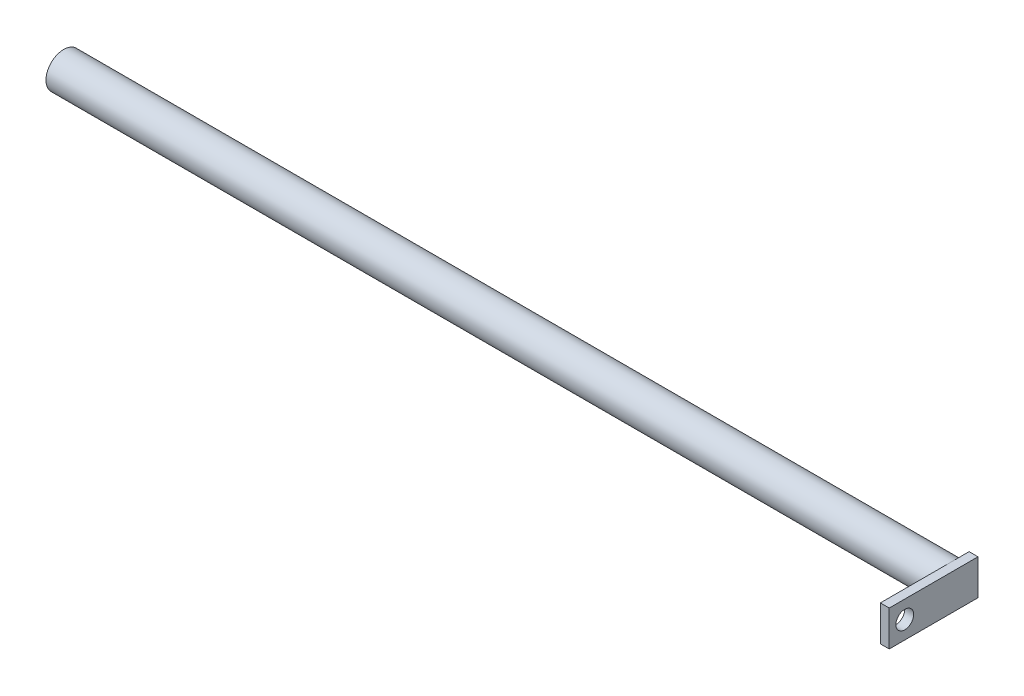
ISO-10303-21;
HEADER;
FILE_DESCRIPTION(('STEP AP214'),'2;1');
FILE_NAME('part.step','',(''),(''),'','','');
FILE_SCHEMA(('AUTOMOTIVE_DESIGN { 1 0 10303 214 1 1 1 1 }'));
ENDSEC;
DATA;
#1=APPLICATION_CONTEXT('core data for automotive mechanical design processes');
#2=APPLICATION_PROTOCOL_DEFINITION('international standard','automotive_design',2000,#1);
#3=PRODUCT_CONTEXT('',#1,'mechanical');
#4=PRODUCT('Part','Part','',(#3));
#5=PRODUCT_RELATED_PRODUCT_CATEGORY('part','',(#4));
#6=PRODUCT_DEFINITION_FORMATION('','',#4);
#7=PRODUCT_DEFINITION_CONTEXT('part definition',#1,'design');
#8=PRODUCT_DEFINITION('design','',#6,#7);
#9=PRODUCT_DEFINITION_SHAPE('','',#8);
#10=(LENGTH_UNIT() NAMED_UNIT(*) SI_UNIT(.MILLI.,.METRE.));
#11=(NAMED_UNIT(*) PLANE_ANGLE_UNIT() SI_UNIT($,.RADIAN.));
#12=(NAMED_UNIT(*) SI_UNIT($,.STERADIAN.) SOLID_ANGLE_UNIT());
#13=UNCERTAINTY_MEASURE_WITH_UNIT(LENGTH_MEASURE(1.E-05),#10,'distance_accuracy_value','');
#14=(GEOMETRIC_REPRESENTATION_CONTEXT(3) GLOBAL_UNCERTAINTY_ASSIGNED_CONTEXT((#13)) GLOBAL_UNIT_ASSIGNED_CONTEXT((#10,
#11,#12)) REPRESENTATION_CONTEXT('',''));
#15=CARTESIAN_POINT('',(0.,0.,0.));
#16=DIRECTION('',(0.,0.,1.));
#17=DIRECTION('',(1.,0.,0.));
#18=AXIS2_PLACEMENT_3D('',#15,#16,#17);
#19=CARTESIAN_POINT('',(200.,0.,0.));
#20=DIRECTION('',(1.,0.,0.));
#21=DIRECTION('',(0.,0.,-1.));
#22=AXIS2_PLACEMENT_3D('',#19,#20,#21);
#23=CYLINDRICAL_SURFACE('',#22,8.);
#24=CARTESIAN_POINT('',(-200.,0.,0.));
#25=DIRECTION('',(1.,0.,0.));
#26=DIRECTION('',(0.,0.,-1.));
#27=AXIS2_PLACEMENT_3D('',#24,#25,#26);
#28=CIRCLE('',#27,8.);
#29=CARTESIAN_POINT('',(-200.,0.,-7.99999999999993));
#30=VERTEX_POINT('',#29);
#31=EDGE_CURVE('E121',#30,#30,#28,.T.);
#32=ORIENTED_EDGE('',*,*,#31,.T.);
#33=EDGE_LOOP('',(#32));
#34=FACE_BOUND('',#33,.T.);
#35=CARTESIAN_POINT('',(200.,0.,0.));
#36=DIRECTION('',(1.,0.,0.));
#37=DIRECTION('',(0.,0.,-1.));
#38=AXIS2_PLACEMENT_3D('',#35,#36,#37);
#39=CIRCLE('',#38,8.);
#40=CARTESIAN_POINT('',(200.,0.,-8.));
#41=VERTEX_POINT('',#40);
#42=CARTESIAN_POINT('',(200.,8.,0.));
#43=VERTEX_POINT('',#42);
#44=EDGE_CURVE('E11',#41,#43,#39,.T.);
#45=ORIENTED_EDGE('',*,*,#44,.F.);
#46=CARTESIAN_POINT('',(200.,-8.,0.));
#47=VERTEX_POINT('',#46);
#48=EDGE_CURVE('E54',#47,#41,#39,.T.);
#49=ORIENTED_EDGE('',*,*,#48,.F.);
#50=EDGE_CURVE('E53',#43,#47,#39,.T.);
#51=ORIENTED_EDGE('',*,*,#50,.F.);
#52=EDGE_LOOP('',(#45,#49,#51));
#53=FACE_BOUND('',#52,.T.);
#54=ADVANCED_FACE('F45',(#34,#53),#23,.T.);
#55=CARTESIAN_POINT('',(-200.,0.,0.));
#56=DIRECTION('',(-1.,0.,0.));
#57=DIRECTION('',(0.,0.,1.));
#58=AXIS2_PLACEMENT_3D('',#55,#56,#57);
#59=PLANE('',#58);
#60=ORIENTED_EDGE('',*,*,#31,.F.);
#61=EDGE_LOOP('',(#60));
#62=FACE_BOUND('',#61,.T.);
#63=ADVANCED_FACE('F197',(#62),#59,.T.);
#64=CARTESIAN_POINT('',(200.,0.,0.));
#65=DIRECTION('',(-1.,0.,0.));
#66=DIRECTION('',(0.,0.,1.));
#67=AXIS2_PLACEMENT_3D('',#64,#65,#66);
#68=PLANE('',#67);
#69=DIRECTION('',(0.,1.,0.));
#70=VECTOR('',#69,1.);
#71=CARTESIAN_POINT('',(200.,-8.,-8.));
#72=LINE('',#71,#70);
#73=CARTESIAN_POINT('',(200.,8.,-8.));
#74=VERTEX_POINT('',#73);
#75=EDGE_CURVE('E145',#41,#74,#72,.T.);
#76=ORIENTED_EDGE('',*,*,#75,.F.);
#77=ORIENTED_EDGE('',*,*,#44,.T.);
#78=DIRECTION('',(0.,0.,1.));
#79=VECTOR('',#78,1.);
#80=CARTESIAN_POINT('',(200.,8.,-8.));
#81=LINE('',#80,#79);
#82=EDGE_CURVE('E137',#74,#43,#81,.T.);
#83=ORIENTED_EDGE('',*,*,#82,.F.);
#84=EDGE_LOOP('',(#76,#77,#83));
#85=FACE_BOUND('',#84,.T.);
#86=ADVANCED_FACE('F167',(#85),#68,.T.);
#87=CARTESIAN_POINT('',(200.,0.,25.));
#88=DIRECTION('',(-1.,0.,0.));
#89=DIRECTION('',(0.,0.,1.));
#90=AXIS2_PLACEMENT_3D('',#87,#88,#89);
#91=CIRCLE('',#90,4.);
#92=CARTESIAN_POINT('',(200.,0.,29.));
#93=VERTEX_POINT('',#92);
#94=EDGE_CURVE('E157',#93,#93,#91,.T.);
#95=ORIENTED_EDGE('',*,*,#94,.F.);
#96=EDGE_LOOP('',(#95));
#97=FACE_BOUND('',#96,.T.);
#98=CARTESIAN_POINT('',(200.,8.,32.));
#99=VERTEX_POINT('',#98);
#100=EDGE_CURVE('E141',#43,#99,#81,.T.);
#101=ORIENTED_EDGE('',*,*,#100,.F.);
#102=ORIENTED_EDGE('',*,*,#50,.T.);
#103=DIRECTION('',(0.,0.,-1.));
#104=VECTOR('',#103,1.);
#105=CARTESIAN_POINT('',(200.,-8.,-8.));
#106=LINE('',#105,#104);
#107=CARTESIAN_POINT('',(200.,-8.,32.));
#108=VERTEX_POINT('',#107);
#109=EDGE_CURVE('E146',#108,#47,#106,.T.);
#110=ORIENTED_EDGE('',*,*,#109,.F.);
#111=DIRECTION('',(0.,-1.,0.));
#112=VECTOR('',#111,1.);
#113=CARTESIAN_POINT('',(200.,-8.,32.));
#114=LINE('',#113,#112);
#115=EDGE_CURVE('E113',#99,#108,#114,.T.);
#116=ORIENTED_EDGE('',*,*,#115,.F.);
#117=EDGE_LOOP('',(#101,#102,#110,#116));
#118=FACE_BOUND('',#117,.T.);
#119=ADVANCED_FACE('F164',(#97,#118),#68,.T.);
#120=CARTESIAN_POINT('',(204.,-8.,-8.));
#121=DIRECTION('',(0.,1.,0.));
#122=DIRECTION('',(0.,0.,1.));
#123=AXIS2_PLACEMENT_3D('',#120,#121,#122);
#124=PLANE('',#123);
#125=ORIENTED_EDGE('',*,*,#109,.T.);
#126=CARTESIAN_POINT('',(200.,-8.,-8.));
#127=VERTEX_POINT('',#126);
#128=EDGE_CURVE('E118',#47,#127,#106,.T.);
#129=ORIENTED_EDGE('',*,*,#128,.T.);
#130=DIRECTION('',(-1.,0.,0.));
#131=VECTOR('',#130,1.);
#132=CARTESIAN_POINT('',(204.,-8.,-8.));
#133=LINE('',#132,#131);
#134=CARTESIAN_POINT('',(204.,-8.,-8.));
#135=VERTEX_POINT('',#134);
#136=EDGE_CURVE('E96',#135,#127,#133,.T.);
#137=ORIENTED_EDGE('',*,*,#136,.F.);
#138=DIRECTION('',(0.,0.,-1.));
#139=VECTOR('',#138,1.);
#140=CARTESIAN_POINT('',(204.,-8.,-8.));
#141=LINE('',#140,#139);
#142=CARTESIAN_POINT('',(204.,-8.,32.));
#143=VERTEX_POINT('',#142);
#144=EDGE_CURVE('E103',#143,#135,#141,.T.);
#145=ORIENTED_EDGE('',*,*,#144,.F.);
#146=DIRECTION('',(-1.,0.,0.));
#147=VECTOR('',#146,1.);
#148=CARTESIAN_POINT('',(204.,-8.,32.));
#149=LINE('',#148,#147);
#150=EDGE_CURVE('E132',#143,#108,#149,.T.);
#151=ORIENTED_EDGE('',*,*,#150,.T.);
#152=EDGE_LOOP('',(#125,#129,#137,#145,#151));
#153=FACE_BOUND('',#152,.T.);
#154=ADVANCED_FACE('F116',(#153),#124,.F.);
#155=CARTESIAN_POINT('',(204.,-8.,-8.));
#156=DIRECTION('',(0.,0.,1.));
#157=DIRECTION('',(1.,0.,0.));
#158=AXIS2_PLACEMENT_3D('',#155,#156,#157);
#159=PLANE('',#158);
#160=EDGE_CURVE('E142',#127,#41,#72,.T.);
#161=ORIENTED_EDGE('',*,*,#160,.T.);
#162=ORIENTED_EDGE('',*,*,#75,.T.);
#163=DIRECTION('',(-1.,0.,0.));
#164=VECTOR('',#163,1.);
#165=CARTESIAN_POINT('',(204.,8.,-8.));
#166=LINE('',#165,#164);
#167=CARTESIAN_POINT('',(204.,8.,-8.));
#168=VERTEX_POINT('',#167);
#169=EDGE_CURVE('E98',#168,#74,#166,.T.);
#170=ORIENTED_EDGE('',*,*,#169,.F.);
#171=DIRECTION('',(0.,1.,0.));
#172=VECTOR('',#171,1.);
#173=CARTESIAN_POINT('',(204.,-8.,-8.));
#174=LINE('',#173,#172);
#175=EDGE_CURVE('E91',#135,#168,#174,.T.);
#176=ORIENTED_EDGE('',*,*,#175,.F.);
#177=ORIENTED_EDGE('',*,*,#136,.T.);
#178=EDGE_LOOP('',(#161,#162,#170,#176,#177));
#179=FACE_BOUND('',#178,.T.);
#180=ADVANCED_FACE('F94',(#179),#159,.F.);
#181=CARTESIAN_POINT('',(204.,8.,-8.));
#182=DIRECTION('',(0.,-1.,0.));
#183=DIRECTION('',(0.,0.,-1.));
#184=AXIS2_PLACEMENT_3D('',#181,#182,#183);
#185=PLANE('',#184);
#186=ORIENTED_EDGE('',*,*,#82,.T.);
#187=ORIENTED_EDGE('',*,*,#100,.T.);
#188=DIRECTION('',(-1.,0.,0.));
#189=VECTOR('',#188,1.);
#190=CARTESIAN_POINT('',(204.,8.,32.));
#191=LINE('',#190,#189);
#192=CARTESIAN_POINT('',(204.,8.,32.));
#193=VERTEX_POINT('',#192);
#194=EDGE_CURVE('E126',#193,#99,#191,.T.);
#195=ORIENTED_EDGE('',*,*,#194,.F.);
#196=DIRECTION('',(0.,0.,1.));
#197=VECTOR('',#196,1.);
#198=CARTESIAN_POINT('',(204.,8.,-8.));
#199=LINE('',#198,#197);
#200=EDGE_CURVE('E102',#168,#193,#199,.T.);
#201=ORIENTED_EDGE('',*,*,#200,.F.);
#202=ORIENTED_EDGE('',*,*,#169,.T.);
#203=EDGE_LOOP('',(#186,#187,#195,#201,#202));
#204=FACE_BOUND('',#203,.T.);
#205=ADVANCED_FACE('F177',(#204),#185,.F.);
#206=CARTESIAN_POINT('',(204.,-8.,32.));
#207=DIRECTION('',(0.,0.,-1.));
#208=DIRECTION('',(-1.,0.,0.));
#209=AXIS2_PLACEMENT_3D('',#206,#207,#208);
#210=PLANE('',#209);
#211=ORIENTED_EDGE('',*,*,#115,.T.);
#212=ORIENTED_EDGE('',*,*,#150,.F.);
#213=DIRECTION('',(0.,-1.,0.));
#214=VECTOR('',#213,1.);
#215=CARTESIAN_POINT('',(204.,-8.,32.));
#216=LINE('',#215,#214);
#217=EDGE_CURVE('E108',#193,#143,#216,.T.);
#218=ORIENTED_EDGE('',*,*,#217,.F.);
#219=ORIENTED_EDGE('',*,*,#194,.T.);
#220=EDGE_LOOP('',(#211,#212,#218,#219));
#221=FACE_BOUND('',#220,.T.);
#222=ADVANCED_FACE('F185',(#221),#210,.F.);
#223=CARTESIAN_POINT('',(204.,0.,0.));
#224=DIRECTION('',(-1.,0.,0.));
#225=DIRECTION('',(0.,0.,1.));
#226=AXIS2_PLACEMENT_3D('',#223,#224,#225);
#227=PLANE('',#226);
#228=CARTESIAN_POINT('',(204.,0.,25.));
#229=DIRECTION('',(-1.,0.,0.));
#230=DIRECTION('',(0.,0.,1.));
#231=AXIS2_PLACEMENT_3D('',#228,#229,#230);
#232=CIRCLE('',#231,4.);
#233=CARTESIAN_POINT('',(204.,0.,29.));
#234=VERTEX_POINT('',#233);
#235=EDGE_CURVE('E153',#234,#234,#232,.F.);
#236=ORIENTED_EDGE('',*,*,#235,.F.);
#237=EDGE_LOOP('',(#236));
#238=FACE_BOUND('',#237,.T.);
#239=ORIENTED_EDGE('',*,*,#144,.T.);
#240=ORIENTED_EDGE('',*,*,#175,.T.);
#241=ORIENTED_EDGE('',*,*,#200,.T.);
#242=ORIENTED_EDGE('',*,*,#217,.T.);
#243=EDGE_LOOP('',(#239,#240,#241,#242));
#244=FACE_BOUND('',#243,.T.);
#245=ADVANCED_FACE('F106',(#238,#244),#227,.F.);
#246=ORIENTED_EDGE('',*,*,#128,.F.);
#247=ORIENTED_EDGE('',*,*,#48,.T.);
#248=ORIENTED_EDGE('',*,*,#160,.F.);
#249=EDGE_LOOP('',(#246,#247,#248));
#250=FACE_BOUND('',#249,.T.);
#251=ADVANCED_FACE('F169',(#250),#68,.T.);
#252=CARTESIAN_POINT('',(215.313708498985,0.,25.));
#253=DIRECTION('',(-1.,0.,0.));
#254=DIRECTION('',(0.,0.,1.));
#255=AXIS2_PLACEMENT_3D('',#252,#253,#254);
#256=CYLINDRICAL_SURFACE('',#255,4.);
#257=CARTESIAN_POINT('',(204.,0.,29.));
#258=CARTESIAN_POINT('',(203.958333333333,0.,29.));
#259=CARTESIAN_POINT('',(203.916666666667,0.,29.));
#260=CARTESIAN_POINT('',(203.833333333333,0.,29.));
#261=CARTESIAN_POINT('',(203.791666666667,0.,29.));
#262=CARTESIAN_POINT('',(203.708333333333,0.,29.));
#263=CARTESIAN_POINT('',(203.666666666667,0.,29.));
#264=CARTESIAN_POINT('',(203.583333333333,0.,29.));
#265=CARTESIAN_POINT('',(203.541666666667,0.,29.));
#266=CARTESIAN_POINT('',(203.458333333333,0.,29.));
#267=CARTESIAN_POINT('',(203.416666666667,0.,29.));
#268=CARTESIAN_POINT('',(203.333333333333,0.,29.));
#269=CARTESIAN_POINT('',(203.291666666667,0.,29.));
#270=CARTESIAN_POINT('',(203.208333333333,0.,29.));
#271=CARTESIAN_POINT('',(203.166666666667,0.,29.));
#272=CARTESIAN_POINT('',(203.083333333333,0.,29.));
#273=CARTESIAN_POINT('',(203.041666666667,0.,29.));
#274=CARTESIAN_POINT('',(202.958333333333,0.,29.));
#275=CARTESIAN_POINT('',(202.916666666667,0.,29.));
#276=CARTESIAN_POINT('',(202.833333333333,0.,29.));
#277=CARTESIAN_POINT('',(202.791666666667,0.,29.));
#278=CARTESIAN_POINT('',(202.708333333333,0.,29.));
#279=CARTESIAN_POINT('',(202.666666666667,0.,29.));
#280=CARTESIAN_POINT('',(202.583333333333,0.,29.));
#281=CARTESIAN_POINT('',(202.541666666667,0.,29.));
#282=CARTESIAN_POINT('',(202.458333333333,0.,29.));
#283=CARTESIAN_POINT('',(202.416666666667,0.,29.));
#284=CARTESIAN_POINT('',(202.333333333333,0.,29.));
#285=CARTESIAN_POINT('',(202.291666666667,0.,29.));
#286=CARTESIAN_POINT('',(202.208333333333,0.,29.));
#287=CARTESIAN_POINT('',(202.166666666667,0.,29.));
#288=CARTESIAN_POINT('',(202.083333333333,0.,29.));
#289=CARTESIAN_POINT('',(202.041666666667,0.,29.));
#290=CARTESIAN_POINT('',(201.958333333333,0.,29.));
#291=CARTESIAN_POINT('',(201.916666666667,0.,29.));
#292=CARTESIAN_POINT('',(201.833333333333,0.,29.));
#293=CARTESIAN_POINT('',(201.791666666667,0.,29.));
#294=CARTESIAN_POINT('',(201.708333333333,0.,29.));
#295=CARTESIAN_POINT('',(201.666666666667,0.,29.));
#296=CARTESIAN_POINT('',(201.583333333333,0.,29.));
#297=CARTESIAN_POINT('',(201.541666666667,0.,29.));
#298=CARTESIAN_POINT('',(201.458333333333,0.,29.));
#299=CARTESIAN_POINT('',(201.416666666667,0.,29.));
#300=CARTESIAN_POINT('',(201.333333333333,0.,29.));
#301=CARTESIAN_POINT('',(201.291666666667,0.,29.));
#302=CARTESIAN_POINT('',(201.208333333333,0.,29.));
#303=CARTESIAN_POINT('',(201.166666666667,0.,29.));
#304=CARTESIAN_POINT('',(201.083333333333,0.,29.));
#305=CARTESIAN_POINT('',(201.041666666667,0.,29.));
#306=CARTESIAN_POINT('',(200.958333333333,0.,29.));
#307=CARTESIAN_POINT('',(200.916666666667,0.,29.));
#308=CARTESIAN_POINT('',(200.833333333333,0.,29.));
#309=CARTESIAN_POINT('',(200.791666666667,0.,29.));
#310=CARTESIAN_POINT('',(200.708333333333,0.,29.));
#311=CARTESIAN_POINT('',(200.666666666667,0.,29.));
#312=CARTESIAN_POINT('',(200.583333333333,0.,29.));
#313=CARTESIAN_POINT('',(200.541666666667,0.,29.));
#314=CARTESIAN_POINT('',(200.458333333333,0.,29.));
#315=CARTESIAN_POINT('',(200.416666666667,0.,29.));
#316=CARTESIAN_POINT('',(200.333333333333,0.,29.));
#317=CARTESIAN_POINT('',(200.291666666667,0.,29.));
#318=CARTESIAN_POINT('',(200.208333333333,0.,29.));
#319=CARTESIAN_POINT('',(200.166666666667,0.,29.));
#320=CARTESIAN_POINT('',(200.083333333333,0.,29.));
#321=CARTESIAN_POINT('',(200.041666666667,0.,29.));
#322=CARTESIAN_POINT('',(200.,0.,29.));
#323=B_SPLINE_CURVE_WITH_KNOTS('',3,(#257,#258,#259,#260,#261,#262,#263,#264,#265,#266,#267,
#268,#269,#270,#271,#272,#273,#274,#275,#276,#277,#278,#279,#280,#281,#282,#283,#284,#285,#286,
#287,#288,#289,#290,#291,#292,#293,#294,#295,#296,#297,#298,#299,#300,#301,#302,#303,#304,#305,
#306,#307,#308,#309,#310,#311,#312,#313,#314,#315,#316,#317,#318,#319,#320,#321,#322),
.UNSPECIFIED.,.F.,.F.,(4,2,2,2,2,2,2,2,2,2,2,2,2,2,2,2,2,2,2,2,2,2,2,2,2,2,2,2,2,2,2,2,4),(0.,
0.125000000000014,0.25,0.375000000000014,0.5,0.625000000000014,0.750000000000001,
0.875000000000015,1.,1.12500000000001,1.25,1.37500000000002,1.5,1.62500000000002,1.75,
1.87500000000002,2.,2.12500000000002,2.25,2.37500000000002,2.5,2.62500000000002,2.75,
2.87500000000002,3.,3.12500000000002,3.25,3.37500000000002,3.5,3.62500000000002,3.75,
3.87500000000002,4.),.UNSPECIFIED.);
#324=EDGE_CURVE('BSEAM162',#234,#93,#323,.T.);
#325=ORIENTED_EDGE('',*,*,#235,.T.);
#326=ORIENTED_EDGE('',*,*,#94,.T.);
#327=ORIENTED_EDGE('',*,*,#324,.T.);
#328=ORIENTED_EDGE('',*,*,#324,.F.);
#329=EDGE_LOOP('',(#325,#327,#326,#328));
#330=FACE_BOUND('',#329,.T.);
#331=ADVANCED_FACE('F162',(#330),#256,.F.);
#332=CLOSED_SHELL('',(#54,#63,#86,#119,#154,#180,#205,#222,#245,#251,#331));
#333=MANIFOLD_SOLID_BREP('B2',#332);
#334=ADVANCED_BREP_SHAPE_REPRESENTATION('',(#18,#333),#14);
#335=SHAPE_DEFINITION_REPRESENTATION(#9,#334);
ENDSEC;
END-ISO-10303-21;
